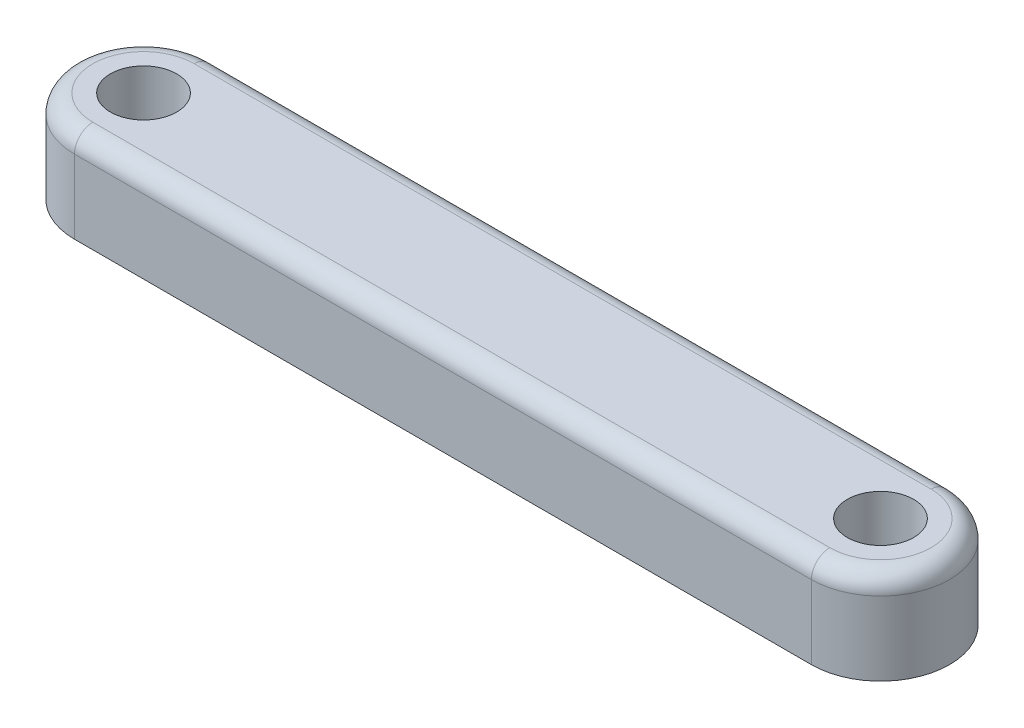
ISO-10303-21;
HEADER;
FILE_DESCRIPTION(('STEP AP214'),'2;1');
FILE_NAME('part.step','',(''),(''),'','','');
FILE_SCHEMA(('AUTOMOTIVE_DESIGN { 1 0 10303 214 1 1 1 1 }'));
ENDSEC;
DATA;
#1=APPLICATION_CONTEXT('core data for automotive mechanical design processes');
#2=APPLICATION_PROTOCOL_DEFINITION('international standard','automotive_design',2000,#1);
#3=PRODUCT_CONTEXT('',#1,'mechanical');
#4=PRODUCT('Part','Part','',(#3));
#5=PRODUCT_RELATED_PRODUCT_CATEGORY('part','',(#4));
#6=PRODUCT_DEFINITION_FORMATION('','',#4);
#7=PRODUCT_DEFINITION_CONTEXT('part definition',#1,'design');
#8=PRODUCT_DEFINITION('design','',#6,#7);
#9=PRODUCT_DEFINITION_SHAPE('','',#8);
#10=(LENGTH_UNIT() NAMED_UNIT(*) SI_UNIT(.MILLI.,.METRE.));
#11=(NAMED_UNIT(*) PLANE_ANGLE_UNIT() SI_UNIT($,.RADIAN.));
#12=(NAMED_UNIT(*) SI_UNIT($,.STERADIAN.) SOLID_ANGLE_UNIT());
#13=UNCERTAINTY_MEASURE_WITH_UNIT(LENGTH_MEASURE(1.E-05),#10,'distance_accuracy_value','');
#14=(GEOMETRIC_REPRESENTATION_CONTEXT(3) GLOBAL_UNCERTAINTY_ASSIGNED_CONTEXT((#13)) GLOBAL_UNIT_ASSIGNED_CONTEXT((#10,
#11,#12)) REPRESENTATION_CONTEXT('',''));
#15=CARTESIAN_POINT('',(0.,0.,0.));
#16=DIRECTION('',(0.,0.,1.));
#17=DIRECTION('',(1.,0.,0.));
#18=AXIS2_PLACEMENT_3D('',#15,#16,#17);
#19=CARTESIAN_POINT('',(0.,6.35,0.));
#20=DIRECTION('',(0.,1.,0.));
#21=DIRECTION('',(0.,0.,-1.));
#22=AXIS2_PLACEMENT_3D('',#19,#20,#21);
#23=PLANE('',#22);
#24=DIRECTION('',(1.,0.,0.));
#25=VECTOR('',#24,1.);
#26=CARTESIAN_POINT('',(0.,6.35,-3.4925));
#27=LINE('',#26,#25);
#28=CARTESIAN_POINT('',(-50.8,6.35,-3.49250000000001));
#29=VERTEX_POINT('',#28);
#30=CARTESIAN_POINT('',(0.,6.35,-3.4925));
#31=VERTEX_POINT('',#30);
#32=EDGE_CURVE('E140',#29,#31,#27,.T.);
#33=ORIENTED_EDGE('',*,*,#32,.F.);
#34=CARTESIAN_POINT('',(-50.8,6.35,0.));
#35=DIRECTION('',(0.,-1.,0.));
#36=DIRECTION('',(0.,0.,-1.));
#37=AXIS2_PLACEMENT_3D('',#34,#35,#36);
#38=CIRCLE('',#37,3.4925);
#39=CARTESIAN_POINT('',(-50.8,6.35,3.49249999999999));
#40=VERTEX_POINT('',#39);
#41=EDGE_CURVE('E138',#40,#29,#38,.T.);
#42=ORIENTED_EDGE('',*,*,#41,.F.);
#43=DIRECTION('',(-1.,0.,0.));
#44=VECTOR('',#43,1.);
#45=CARTESIAN_POINT('',(-50.8,6.35,3.49249999999999));
#46=LINE('',#45,#44);
#47=CARTESIAN_POINT('',(0.,6.35,3.4925));
#48=VERTEX_POINT('',#47);
#49=EDGE_CURVE('E106',#48,#40,#46,.T.);
#50=ORIENTED_EDGE('',*,*,#49,.F.);
#51=CARTESIAN_POINT('',(0.,6.35,0.));
#52=DIRECTION('',(0.,-1.,0.));
#53=DIRECTION('',(0.,0.,-1.));
#54=AXIS2_PLACEMENT_3D('',#51,#52,#53);
#55=CIRCLE('',#54,3.4925);
#56=EDGE_CURVE('E143',#31,#48,#55,.T.);
#57=ORIENTED_EDGE('',*,*,#56,.F.);
#58=EDGE_LOOP('',(#33,#42,#50,#57));
#59=FACE_BOUND('',#58,.T.);
#60=CARTESIAN_POINT('',(-50.8,6.35,0.));
#61=DIRECTION('',(0.,-1.,0.));
#62=DIRECTION('',(0.,0.,-1.));
#63=AXIS2_PLACEMENT_3D('',#60,#61,#62);
#64=CIRCLE('',#63,2.286);
#65=CARTESIAN_POINT('',(-50.8,6.35,-2.28600000000001));
#66=VERTEX_POINT('',#65);
#67=EDGE_CURVE('E123',#66,#66,#64,.T.);
#68=ORIENTED_EDGE('',*,*,#67,.T.);
#69=EDGE_LOOP('',(#68));
#70=FACE_BOUND('',#69,.T.);
#71=CARTESIAN_POINT('',(0.,6.35,0.));
#72=DIRECTION('',(0.,-1.,0.));
#73=DIRECTION('',(0.,0.,-1.));
#74=AXIS2_PLACEMENT_3D('',#71,#72,#73);
#75=CIRCLE('',#74,2.286);
#76=CARTESIAN_POINT('',(0.,6.35,-2.286));
#77=VERTEX_POINT('',#76);
#78=EDGE_CURVE('E155',#77,#77,#75,.T.);
#79=ORIENTED_EDGE('',*,*,#78,.T.);
#80=EDGE_LOOP('',(#79));
#81=FACE_BOUND('',#80,.T.);
#82=ADVANCED_FACE('F41',(#59,#70,#81),#23,.T.);
#83=CARTESIAN_POINT('',(0.,0.,0.));
#84=DIRECTION('',(0.,1.,0.));
#85=DIRECTION('',(0.,0.,-1.));
#86=AXIS2_PLACEMENT_3D('',#83,#84,#85);
#87=PLANE('',#86);
#88=CARTESIAN_POINT('',(0.,0.,0.));
#89=DIRECTION('',(0.,-1.,0.));
#90=DIRECTION('',(0.,0.,-1.));
#91=AXIS2_PLACEMENT_3D('',#88,#89,#90);
#92=CIRCLE('',#91,4.7625);
#93=CARTESIAN_POINT('',(0.,0.,-4.7625));
#94=VERTEX_POINT('',#93);
#95=CARTESIAN_POINT('',(0.,0.,4.7625));
#96=VERTEX_POINT('',#95);
#97=EDGE_CURVE('E101',#94,#96,#92,.T.);
#98=ORIENTED_EDGE('',*,*,#97,.T.);
#99=DIRECTION('',(-1.,0.,0.));
#100=VECTOR('',#99,1.);
#101=CARTESIAN_POINT('',(0.,0.,4.7625));
#102=LINE('',#101,#100);
#103=CARTESIAN_POINT('',(-50.8,0.,4.76249999999999));
#104=VERTEX_POINT('',#103);
#105=EDGE_CURVE('E110',#96,#104,#102,.T.);
#106=ORIENTED_EDGE('',*,*,#105,.T.);
#107=CARTESIAN_POINT('',(-50.8,0.,0.));
#108=DIRECTION('',(0.,-1.,0.));
#109=DIRECTION('',(0.,0.,-1.));
#110=AXIS2_PLACEMENT_3D('',#107,#108,#109);
#111=CIRCLE('',#110,4.7625);
#112=CARTESIAN_POINT('',(-50.8,0.,-4.76250000000001));
#113=VERTEX_POINT('',#112);
#114=EDGE_CURVE('E116',#104,#113,#111,.T.);
#115=ORIENTED_EDGE('',*,*,#114,.T.);
#116=DIRECTION('',(1.,0.,0.));
#117=VECTOR('',#116,1.);
#118=CARTESIAN_POINT('',(0.,0.,-4.7625));
#119=LINE('',#118,#117);
#120=EDGE_CURVE('E122',#113,#94,#119,.T.);
#121=ORIENTED_EDGE('',*,*,#120,.T.);
#122=EDGE_LOOP('',(#98,#106,#115,#121));
#123=FACE_BOUND('',#122,.T.);
#124=CARTESIAN_POINT('',(-50.8,0.,0.));
#125=DIRECTION('',(0.,-1.,0.));
#126=DIRECTION('',(0.,0.,-1.));
#127=AXIS2_PLACEMENT_3D('',#124,#125,#126);
#128=CIRCLE('',#127,2.286);
#129=CARTESIAN_POINT('',(-50.8,0.,-2.28600000000001));
#130=VERTEX_POINT('',#129);
#131=EDGE_CURVE('E126',#130,#130,#128,.T.);
#132=ORIENTED_EDGE('',*,*,#131,.F.);
#133=EDGE_LOOP('',(#132));
#134=FACE_BOUND('',#133,.T.);
#135=CARTESIAN_POINT('',(0.,0.,0.));
#136=DIRECTION('',(0.,-1.,0.));
#137=DIRECTION('',(0.,0.,-1.));
#138=AXIS2_PLACEMENT_3D('',#135,#136,#137);
#139=CIRCLE('',#138,2.286);
#140=CARTESIAN_POINT('',(0.,0.,-2.286));
#141=VERTEX_POINT('',#140);
#142=EDGE_CURVE('E153',#141,#141,#139,.T.);
#143=ORIENTED_EDGE('',*,*,#142,.F.);
#144=EDGE_LOOP('',(#143));
#145=FACE_BOUND('',#144,.T.);
#146=ADVANCED_FACE('F119',(#123,#134,#145),#87,.F.);
#147=CARTESIAN_POINT('',(0.,6.35,0.));
#148=DIRECTION('',(0.,-1.,0.));
#149=DIRECTION('',(0.,0.,1.));
#150=AXIS2_PLACEMENT_3D('',#147,#148,#149);
#151=CYLINDRICAL_SURFACE('',#150,4.7625);
#152=DIRECTION('',(0.,-1.,0.));
#153=VECTOR('',#152,1.);
#154=CARTESIAN_POINT('',(0.,6.35,4.7625));
#155=LINE('',#154,#153);
#156=CARTESIAN_POINT('',(0.,5.08,4.7625));
#157=VERTEX_POINT('',#156);
#158=EDGE_CURVE('E96',#157,#96,#155,.T.);
#159=ORIENTED_EDGE('',*,*,#158,.T.);
#160=ORIENTED_EDGE('',*,*,#97,.F.);
#161=DIRECTION('',(0.,-1.,0.));
#162=VECTOR('',#161,1.);
#163=CARTESIAN_POINT('',(0.,6.35,-4.7625));
#164=LINE('',#163,#162);
#165=CARTESIAN_POINT('',(0.,5.08,-4.7625));
#166=VERTEX_POINT('',#165);
#167=EDGE_CURVE('E132',#166,#94,#164,.T.);
#168=ORIENTED_EDGE('',*,*,#167,.F.);
#169=CARTESIAN_POINT('',(0.,5.08,0.));
#170=DIRECTION('',(0.,-1.,0.));
#171=DIRECTION('',(0.,0.,-1.));
#172=AXIS2_PLACEMENT_3D('',#169,#170,#171);
#173=CIRCLE('',#172,4.7625);
#174=EDGE_CURVE('E103',#157,#166,#173,.F.);
#175=ORIENTED_EDGE('',*,*,#174,.F.);
#176=EDGE_LOOP('',(#159,#160,#168,#175));
#177=FACE_BOUND('',#176,.T.);
#178=ADVANCED_FACE('F98',(#177),#151,.T.);
#179=CARTESIAN_POINT('',(0.,6.35,4.7625));
#180=DIRECTION('',(0.,0.,-1.));
#181=DIRECTION('',(1.,0.,0.));
#182=AXIS2_PLACEMENT_3D('',#179,#180,#181);
#183=PLANE('',#182);
#184=DIRECTION('',(0.,-1.,0.));
#185=VECTOR('',#184,1.);
#186=CARTESIAN_POINT('',(-50.8,6.35,4.76249999999999));
#187=LINE('',#186,#185);
#188=CARTESIAN_POINT('',(-50.8,5.08,4.76249999999999));
#189=VERTEX_POINT('',#188);
#190=EDGE_CURVE('E107',#189,#104,#187,.T.);
#191=ORIENTED_EDGE('',*,*,#190,.T.);
#192=ORIENTED_EDGE('',*,*,#105,.F.);
#193=ORIENTED_EDGE('',*,*,#158,.F.);
#194=DIRECTION('',(-1.,0.,0.));
#195=VECTOR('',#194,1.);
#196=CARTESIAN_POINT('',(0.,5.08,4.7625));
#197=LINE('',#196,#195);
#198=EDGE_CURVE('E11',#189,#157,#197,.F.);
#199=ORIENTED_EDGE('',*,*,#198,.F.);
#200=EDGE_LOOP('',(#191,#192,#193,#199));
#201=FACE_BOUND('',#200,.T.);
#202=ADVANCED_FACE('F111',(#201),#183,.F.);
#203=CARTESIAN_POINT('',(-50.8,6.35,0.));
#204=DIRECTION('',(0.,-1.,0.));
#205=DIRECTION('',(0.,0.,1.));
#206=AXIS2_PLACEMENT_3D('',#203,#204,#205);
#207=CYLINDRICAL_SURFACE('',#206,4.7625);
#208=DIRECTION('',(0.,-1.,0.));
#209=VECTOR('',#208,1.);
#210=CARTESIAN_POINT('',(-50.8,6.35,-4.76250000000001));
#211=LINE('',#210,#209);
#212=CARTESIAN_POINT('',(-50.8,5.08,-4.76250000000001));
#213=VERTEX_POINT('',#212);
#214=EDGE_CURVE('E134',#213,#113,#211,.T.);
#215=ORIENTED_EDGE('',*,*,#214,.T.);
#216=ORIENTED_EDGE('',*,*,#114,.F.);
#217=ORIENTED_EDGE('',*,*,#190,.F.);
#218=CARTESIAN_POINT('',(-50.8,5.08,0.));
#219=DIRECTION('',(0.,-1.,0.));
#220=DIRECTION('',(0.,0.,-1.));
#221=AXIS2_PLACEMENT_3D('',#218,#219,#220);
#222=CIRCLE('',#221,4.7625);
#223=EDGE_CURVE('E50',#213,#189,#222,.F.);
#224=ORIENTED_EDGE('',*,*,#223,.F.);
#225=EDGE_LOOP('',(#215,#216,#217,#224));
#226=FACE_BOUND('',#225,.T.);
#227=ADVANCED_FACE('F182',(#226),#207,.T.);
#228=CARTESIAN_POINT('',(0.,6.35,-4.7625));
#229=DIRECTION('',(0.,0.,1.));
#230=DIRECTION('',(-1.,0.,0.));
#231=AXIS2_PLACEMENT_3D('',#228,#229,#230);
#232=PLANE('',#231);
#233=ORIENTED_EDGE('',*,*,#167,.T.);
#234=ORIENTED_EDGE('',*,*,#120,.F.);
#235=ORIENTED_EDGE('',*,*,#214,.F.);
#236=DIRECTION('',(1.,0.,0.));
#237=VECTOR('',#236,1.);
#238=CARTESIAN_POINT('',(-50.8,5.08,-4.76250000000001));
#239=LINE('',#238,#237);
#240=EDGE_CURVE('E147',#166,#213,#239,.F.);
#241=ORIENTED_EDGE('',*,*,#240,.F.);
#242=EDGE_LOOP('',(#233,#234,#235,#241));
#243=FACE_BOUND('',#242,.T.);
#244=ADVANCED_FACE('F179',(#243),#232,.F.);
#245=CARTESIAN_POINT('',(-50.8,6.35,0.));
#246=DIRECTION('',(0.,-1.,0.));
#247=DIRECTION('',(0.,0.,1.));
#248=AXIS2_PLACEMENT_3D('',#245,#246,#247);
#249=CYLINDRICAL_SURFACE('',#248,2.286);
#250=ORIENTED_EDGE('',*,*,#67,.F.);
#251=EDGE_LOOP('',(#250));
#252=FACE_BOUND('',#251,.T.);
#253=ORIENTED_EDGE('',*,*,#131,.T.);
#254=EDGE_LOOP('',(#253));
#255=FACE_BOUND('',#254,.T.);
#256=ADVANCED_FACE('F166',(#252,#255),#249,.F.);
#257=CARTESIAN_POINT('',(0.,6.35,0.));
#258=DIRECTION('',(0.,-1.,0.));
#259=DIRECTION('',(0.,0.,1.));
#260=AXIS2_PLACEMENT_3D('',#257,#258,#259);
#261=CYLINDRICAL_SURFACE('',#260,2.286);
#262=ORIENTED_EDGE('',*,*,#78,.F.);
#263=EDGE_LOOP('',(#262));
#264=FACE_BOUND('',#263,.T.);
#265=ORIENTED_EDGE('',*,*,#142,.T.);
#266=EDGE_LOOP('',(#265));
#267=FACE_BOUND('',#266,.T.);
#268=ADVANCED_FACE('F201',(#264,#267),#261,.F.);
#269=CARTESIAN_POINT('',(-50.8,5.08,0.));
#270=DIRECTION('',(0.,1.,0.));
#271=DIRECTION('',(0.,0.,-1.));
#272=AXIS2_PLACEMENT_3D('',#269,#270,#271);
#273=TOROIDAL_SURFACE('',#272,3.4925,1.27);
#274=CARTESIAN_POINT('',(-50.8,5.08,3.49249999999999));
#275=DIRECTION('',(-1.,0.,0.));
#276=DIRECTION('',(0.,0.,1.));
#277=AXIS2_PLACEMENT_3D('',#274,#275,#276);
#278=CIRCLE('',#277,1.27);
#279=EDGE_CURVE('E57',#189,#40,#278,.T.);
#280=ORIENTED_EDGE('',*,*,#279,.T.);
#281=ORIENTED_EDGE('',*,*,#41,.T.);
#282=CARTESIAN_POINT('',(-50.8,5.08,-3.49250000000001));
#283=DIRECTION('',(-1.,0.,0.));
#284=DIRECTION('',(0.,0.,1.));
#285=AXIS2_PLACEMENT_3D('',#282,#283,#284);
#286=CIRCLE('',#285,1.27);
#287=EDGE_CURVE('E45',#29,#213,#286,.T.);
#288=ORIENTED_EDGE('',*,*,#287,.T.);
#289=ORIENTED_EDGE('',*,*,#223,.T.);
#290=EDGE_LOOP('',(#280,#281,#288,#289));
#291=FACE_BOUND('',#290,.T.);
#292=ADVANCED_FACE('F43',(#291),#273,.T.);
#293=CARTESIAN_POINT('',(0.,5.08,-3.4925));
#294=DIRECTION('',(-1.,0.,0.));
#295=DIRECTION('',(0.,0.,-1.));
#296=AXIS2_PLACEMENT_3D('',#293,#294,#295);
#297=CYLINDRICAL_SURFACE('',#296,1.27);
#298=ORIENTED_EDGE('',*,*,#287,.F.);
#299=ORIENTED_EDGE('',*,*,#32,.T.);
#300=CARTESIAN_POINT('',(0.,5.08,-3.4925));
#301=DIRECTION('',(-1.,0.,0.));
#302=DIRECTION('',(0.,0.,1.));
#303=AXIS2_PLACEMENT_3D('',#300,#301,#302);
#304=CIRCLE('',#303,1.27);
#305=EDGE_CURVE('E152',#31,#166,#304,.T.);
#306=ORIENTED_EDGE('',*,*,#305,.T.);
#307=ORIENTED_EDGE('',*,*,#240,.T.);
#308=EDGE_LOOP('',(#298,#299,#306,#307));
#309=FACE_BOUND('',#308,.T.);
#310=ADVANCED_FACE('F195',(#309),#297,.T.);
#311=CARTESIAN_POINT('',(0.,5.08,3.4925));
#312=DIRECTION('',(1.,0.,0.));
#313=DIRECTION('',(0.,0.,1.));
#314=AXIS2_PLACEMENT_3D('',#311,#312,#313);
#315=CYLINDRICAL_SURFACE('',#314,1.27);
#316=ORIENTED_EDGE('',*,*,#279,.F.);
#317=ORIENTED_EDGE('',*,*,#198,.T.);
#318=CARTESIAN_POINT('',(0.,5.08,3.4925));
#319=DIRECTION('',(-1.,0.,0.));
#320=DIRECTION('',(0.,0.,1.));
#321=AXIS2_PLACEMENT_3D('',#318,#319,#320);
#322=CIRCLE('',#321,1.27);
#323=EDGE_CURVE('E150',#157,#48,#322,.T.);
#324=ORIENTED_EDGE('',*,*,#323,.T.);
#325=ORIENTED_EDGE('',*,*,#49,.T.);
#326=EDGE_LOOP('',(#316,#317,#324,#325));
#327=FACE_BOUND('',#326,.T.);
#328=ADVANCED_FACE('F192',(#327),#315,.T.);
#329=CARTESIAN_POINT('',(0.,5.08,0.));
#330=DIRECTION('',(0.,1.,0.));
#331=DIRECTION('',(0.,0.,-1.));
#332=AXIS2_PLACEMENT_3D('',#329,#330,#331);
#333=TOROIDAL_SURFACE('',#332,3.4925,1.27);
#334=ORIENTED_EDGE('',*,*,#305,.F.);
#335=ORIENTED_EDGE('',*,*,#56,.T.);
#336=ORIENTED_EDGE('',*,*,#323,.F.);
#337=ORIENTED_EDGE('',*,*,#174,.T.);
#338=EDGE_LOOP('',(#334,#335,#336,#337));
#339=FACE_BOUND('',#338,.T.);
#340=ADVANCED_FACE('F189',(#339),#333,.T.);
#341=CLOSED_SHELL('',(#82,#146,#178,#202,#227,#244,#256,#268,#292,#310,#328,#340));
#342=MANIFOLD_SOLID_BREP('B2',#341);
#343=ADVANCED_BREP_SHAPE_REPRESENTATION('',(#18,#342),#14);
#344=SHAPE_DEFINITION_REPRESENTATION(#9,#343);
ENDSEC;
END-ISO-10303-21;
